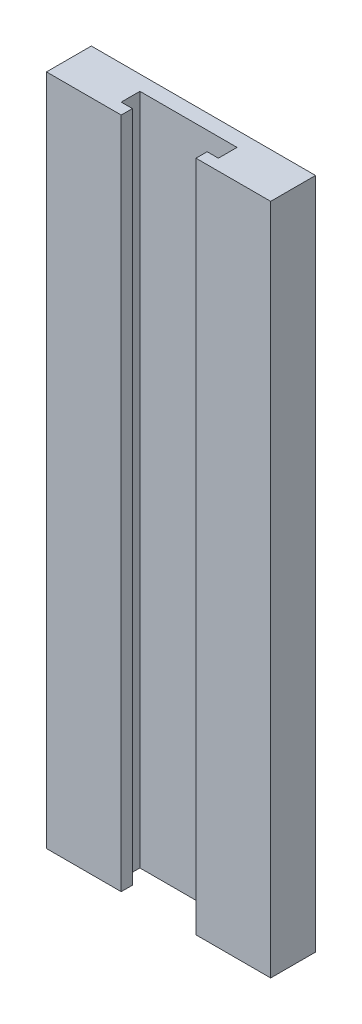
ISO-10303-21;
HEADER;
FILE_DESCRIPTION(('STEP AP214'),'2;1');
FILE_NAME('part.step','',(''),(''),'','','');
FILE_SCHEMA(('AUTOMOTIVE_DESIGN { 1 0 10303 214 1 1 1 1 }'));
ENDSEC;
DATA;
#1=APPLICATION_CONTEXT('core data for automotive mechanical design processes');
#2=APPLICATION_PROTOCOL_DEFINITION('international standard','automotive_design',2000,#1);
#3=PRODUCT_CONTEXT('',#1,'mechanical');
#4=PRODUCT('Part','Part','',(#3));
#5=PRODUCT_RELATED_PRODUCT_CATEGORY('part','',(#4));
#6=PRODUCT_DEFINITION_FORMATION('','',#4);
#7=PRODUCT_DEFINITION_CONTEXT('part definition',#1,'design');
#8=PRODUCT_DEFINITION('design','',#6,#7);
#9=PRODUCT_DEFINITION_SHAPE('','',#8);
#10=(LENGTH_UNIT() NAMED_UNIT(*) SI_UNIT(.MILLI.,.METRE.));
#11=(NAMED_UNIT(*) PLANE_ANGLE_UNIT() SI_UNIT($,.RADIAN.));
#12=(NAMED_UNIT(*) SI_UNIT($,.STERADIAN.) SOLID_ANGLE_UNIT());
#13=UNCERTAINTY_MEASURE_WITH_UNIT(LENGTH_MEASURE(1.E-05),#10,'distance_accuracy_value','');
#14=(GEOMETRIC_REPRESENTATION_CONTEXT(3) GLOBAL_UNCERTAINTY_ASSIGNED_CONTEXT((#13)) GLOBAL_UNIT_ASSIGNED_CONTEXT((#10,
#11,#12)) REPRESENTATION_CONTEXT('',''));
#15=CARTESIAN_POINT('',(0.,0.,0.));
#16=DIRECTION('',(0.,0.,1.));
#17=DIRECTION('',(1.,0.,0.));
#18=AXIS2_PLACEMENT_3D('',#15,#16,#17);
#19=CARTESIAN_POINT('',(6.50000000000001,25.,6.));
#20=DIRECTION('',(1.,0.,0.));
#21=DIRECTION('',(0.,1.,0.));
#22=AXIS2_PLACEMENT_3D('',#19,#20,#21);
#23=PLANE('',#22);
#24=DIRECTION('',(0.,-1.,0.));
#25=VECTOR('',#24,1.);
#26=CARTESIAN_POINT('',(6.50000000000001,25.,4.49999999999997));
#27=LINE('',#26,#25);
#28=CARTESIAN_POINT('',(6.50000000000001,25.,4.49999999999997));
#29=VERTEX_POINT('',#28);
#30=CARTESIAN_POINT('',(6.50000000000003,-65.,4.49999999999998));
#31=VERTEX_POINT('',#30);
#32=EDGE_CURVE('E175',#29,#31,#27,.T.);
#33=ORIENTED_EDGE('',*,*,#32,.F.);
#34=DIRECTION('',(0.,0.,-1.));
#35=VECTOR('',#34,1.);
#36=CARTESIAN_POINT('',(6.50000000000001,25.,6.));
#37=LINE('',#36,#35);
#38=CARTESIAN_POINT('',(6.50000000000002,25.,2.));
#39=VERTEX_POINT('',#38);
#40=EDGE_CURVE('E62',#29,#39,#37,.T.);
#41=ORIENTED_EDGE('',*,*,#40,.T.);
#42=DIRECTION('',(0.,-1.,0.));
#43=VECTOR('',#42,1.);
#44=CARTESIAN_POINT('',(6.50000000000001,25.,2.));
#45=LINE('',#44,#43);
#46=CARTESIAN_POINT('',(6.50000000000002,-65.,2.));
#47=VERTEX_POINT('',#46);
#48=EDGE_CURVE('E211',#39,#47,#45,.T.);
#49=ORIENTED_EDGE('',*,*,#48,.T.);
#50=DIRECTION('',(0.,0.,-1.));
#51=VECTOR('',#50,1.);
#52=CARTESIAN_POINT('',(6.50000000000002,-65.,6.));
#53=LINE('',#52,#51);
#54=EDGE_CURVE('E70',#31,#47,#53,.T.);
#55=ORIENTED_EDGE('',*,*,#54,.F.);
#56=EDGE_LOOP('',(#33,#41,#49,#55));
#57=FACE_BOUND('',#56,.T.);
#58=ADVANCED_FACE('F45',(#57),#23,.F.);
#59=CARTESIAN_POINT('',(-6.5,25.,6.));
#60=DIRECTION('',(-1.,0.,0.));
#61=DIRECTION('',(0.,-1.,0.));
#62=AXIS2_PLACEMENT_3D('',#59,#60,#61);
#63=PLANE('',#62);
#64=DIRECTION('',(0.,1.,0.));
#65=VECTOR('',#64,1.);
#66=CARTESIAN_POINT('',(-6.5,25.,4.5));
#67=LINE('',#66,#65);
#68=CARTESIAN_POINT('',(-6.49999999999999,-65.,4.49999999999998));
#69=VERTEX_POINT('',#68);
#70=CARTESIAN_POINT('',(-6.5,25.,4.5));
#71=VERTEX_POINT('',#70);
#72=EDGE_CURVE('E191',#69,#71,#67,.T.);
#73=ORIENTED_EDGE('',*,*,#72,.F.);
#74=DIRECTION('',(0.,0.,-1.));
#75=VECTOR('',#74,1.);
#76=CARTESIAN_POINT('',(-6.49999999999999,-65.,6.));
#77=LINE('',#76,#75);
#78=CARTESIAN_POINT('',(-6.5,-65.,2.));
#79=VERTEX_POINT('',#78);
#80=EDGE_CURVE('E225',#69,#79,#77,.T.);
#81=ORIENTED_EDGE('',*,*,#80,.T.);
#82=DIRECTION('',(0.,1.,0.));
#83=VECTOR('',#82,1.);
#84=CARTESIAN_POINT('',(-6.5,25.,2.));
#85=LINE('',#84,#83);
#86=CARTESIAN_POINT('',(-6.5,25.,2.));
#87=VERTEX_POINT('',#86);
#88=EDGE_CURVE('E213',#79,#87,#85,.T.);
#89=ORIENTED_EDGE('',*,*,#88,.T.);
#90=DIRECTION('',(0.,0.,-1.));
#91=VECTOR('',#90,1.);
#92=CARTESIAN_POINT('',(-6.5,25.,6.));
#93=LINE('',#92,#91);
#94=EDGE_CURVE('E221',#71,#87,#93,.T.);
#95=ORIENTED_EDGE('',*,*,#94,.F.);
#96=EDGE_LOOP('',(#73,#81,#89,#95));
#97=FACE_BOUND('',#96,.T.);
#98=ADVANCED_FACE('F252',(#97),#63,.F.);
#99=CARTESIAN_POINT('',(0.,0.,2.));
#100=DIRECTION('',(0.,0.,1.));
#101=DIRECTION('',(1.,0.,0.));
#102=AXIS2_PLACEMENT_3D('',#99,#100,#101);
#103=PLANE('',#102);
#104=DIRECTION('',(1.,0.,0.));
#105=VECTOR('',#104,1.);
#106=CARTESIAN_POINT('',(-7.99999999999999,-65.,2.));
#107=LINE('',#106,#105);
#108=EDGE_CURVE('E54',#79,#47,#107,.T.);
#109=ORIENTED_EDGE('',*,*,#108,.T.);
#110=ORIENTED_EDGE('',*,*,#48,.F.);
#111=DIRECTION('',(-1.,0.,0.));
#112=VECTOR('',#111,1.);
#113=CARTESIAN_POINT('',(-8.,25.,2.));
#114=LINE('',#113,#112);
#115=EDGE_CURVE('E11',#39,#87,#114,.T.);
#116=ORIENTED_EDGE('',*,*,#115,.T.);
#117=ORIENTED_EDGE('',*,*,#88,.F.);
#118=EDGE_LOOP('',(#109,#110,#116,#117));
#119=FACE_BOUND('',#118,.T.);
#120=ADVANCED_FACE('F245',(#119),#103,.T.);
#121=CARTESIAN_POINT('',(-7.99999999999999,-65.,2.));
#122=DIRECTION('',(0.,1.,0.));
#123=DIRECTION('',(0.,0.,1.));
#124=AXIS2_PLACEMENT_3D('',#121,#122,#123);
#125=PLANE('',#124);
#126=DIRECTION('',(1.,0.,0.));
#127=VECTOR('',#126,1.);
#128=CARTESIAN_POINT('',(-7.99999999999999,-65.,0.));
#129=LINE('',#128,#127);
#130=CARTESIAN_POINT('',(-15.,-65.,0.));
#131=VERTEX_POINT('',#130);
#132=CARTESIAN_POINT('',(15.,-65.,0.));
#133=VERTEX_POINT('',#132);
#134=EDGE_CURVE('E149',#131,#133,#129,.T.);
#135=ORIENTED_EDGE('',*,*,#134,.T.);
#136=DIRECTION('',(0.,0.,-1.));
#137=VECTOR('',#136,1.);
#138=CARTESIAN_POINT('',(15.,-65.,0.));
#139=LINE('',#138,#137);
#140=CARTESIAN_POINT('',(15.,-65.,6.));
#141=VERTEX_POINT('',#140);
#142=EDGE_CURVE('E172',#141,#133,#139,.T.);
#143=ORIENTED_EDGE('',*,*,#142,.F.);
#144=DIRECTION('',(1.,0.,0.));
#145=VECTOR('',#144,1.);
#146=CARTESIAN_POINT('',(8.00000000000001,-65.,6.));
#147=LINE('',#146,#145);
#148=CARTESIAN_POINT('',(5.00000000000002,-65.,6.));
#149=VERTEX_POINT('',#148);
#150=EDGE_CURVE('E210',#149,#141,#147,.T.);
#151=ORIENTED_EDGE('',*,*,#150,.F.);
#152=DIRECTION('',(0.,0.,1.));
#153=VECTOR('',#152,1.);
#154=CARTESIAN_POINT('',(5.00000000000002,-65.,6.));
#155=LINE('',#154,#153);
#156=CARTESIAN_POINT('',(5.00000000000002,-65.,4.49999999999998));
#157=VERTEX_POINT('',#156);
#158=EDGE_CURVE('E183',#157,#149,#155,.T.);
#159=ORIENTED_EDGE('',*,*,#158,.F.);
#160=DIRECTION('',(1.,0.,0.));
#161=VECTOR('',#160,1.);
#162=CARTESIAN_POINT('',(5.00000000000002,-65.,4.49999999999998));
#163=LINE('',#162,#161);
#164=EDGE_CURVE('E186',#157,#31,#163,.T.);
#165=ORIENTED_EDGE('',*,*,#164,.T.);
#166=ORIENTED_EDGE('',*,*,#54,.T.);
#167=ORIENTED_EDGE('',*,*,#108,.F.);
#168=ORIENTED_EDGE('',*,*,#80,.F.);
#169=DIRECTION('',(-1.,0.,0.));
#170=VECTOR('',#169,1.);
#171=CARTESIAN_POINT('',(-4.99999999999999,-65.,4.49999999999998));
#172=LINE('',#171,#170);
#173=CARTESIAN_POINT('',(-4.99999999999999,-65.,4.49999999999998));
#174=VERTEX_POINT('',#173);
#175=EDGE_CURVE('E206',#174,#69,#172,.T.);
#176=ORIENTED_EDGE('',*,*,#175,.F.);
#177=DIRECTION('',(0.,0.,-1.));
#178=VECTOR('',#177,1.);
#179=CARTESIAN_POINT('',(-4.99999999999999,-65.,6.));
#180=LINE('',#179,#178);
#181=CARTESIAN_POINT('',(-4.99999999999999,-65.,6.));
#182=VERTEX_POINT('',#181);
#183=EDGE_CURVE('E195',#182,#174,#180,.T.);
#184=ORIENTED_EDGE('',*,*,#183,.F.);
#185=DIRECTION('',(1.,0.,0.));
#186=VECTOR('',#185,1.);
#187=CARTESIAN_POINT('',(-8.00000000000001,-65.,6.));
#188=LINE('',#187,#186);
#189=CARTESIAN_POINT('',(-15.,-65.,6.));
#190=VERTEX_POINT('',#189);
#191=EDGE_CURVE('E217',#190,#182,#188,.T.);
#192=ORIENTED_EDGE('',*,*,#191,.F.);
#193=DIRECTION('',(0.,0.,1.));
#194=VECTOR('',#193,1.);
#195=CARTESIAN_POINT('',(-15.,-65.,0.));
#196=LINE('',#195,#194);
#197=EDGE_CURVE('E156',#131,#190,#196,.T.);
#198=ORIENTED_EDGE('',*,*,#197,.F.);
#199=EDGE_LOOP('',(#135,#143,#151,#159,#165,#166,#167,#168,#176,#184,#192,#198));
#200=FACE_BOUND('',#199,.T.);
#201=ADVANCED_FACE('F47',(#200),#125,.F.);
#202=CARTESIAN_POINT('',(-8.,25.,2.));
#203=DIRECTION('',(0.,-1.,0.));
#204=DIRECTION('',(0.,0.,-1.));
#205=AXIS2_PLACEMENT_3D('',#202,#203,#204);
#206=PLANE('',#205);
#207=DIRECTION('',(-1.,0.,0.));
#208=VECTOR('',#207,1.);
#209=CARTESIAN_POINT('',(-8.,25.,0.));
#210=LINE('',#209,#208);
#211=CARTESIAN_POINT('',(15.,25.,0.));
#212=VERTEX_POINT('',#211);
#213=CARTESIAN_POINT('',(-15.,25.,0.));
#214=VERTEX_POINT('',#213);
#215=EDGE_CURVE('E49',#212,#214,#210,.T.);
#216=ORIENTED_EDGE('',*,*,#215,.T.);
#217=DIRECTION('',(0.,0.,-1.));
#218=VECTOR('',#217,1.);
#219=CARTESIAN_POINT('',(-15.,25.,6.));
#220=LINE('',#219,#218);
#221=CARTESIAN_POINT('',(-15.,25.,6.));
#222=VERTEX_POINT('',#221);
#223=EDGE_CURVE('E143',#222,#214,#220,.T.);
#224=ORIENTED_EDGE('',*,*,#223,.F.);
#225=DIRECTION('',(-1.,0.,0.));
#226=VECTOR('',#225,1.);
#227=CARTESIAN_POINT('',(-8.,25.,6.));
#228=LINE('',#227,#226);
#229=CARTESIAN_POINT('',(-5.,25.,6.));
#230=VERTEX_POINT('',#229);
#231=EDGE_CURVE('E219',#230,#222,#228,.T.);
#232=ORIENTED_EDGE('',*,*,#231,.F.);
#233=DIRECTION('',(0.,0.,1.));
#234=VECTOR('',#233,1.);
#235=CARTESIAN_POINT('',(-5.,25.,6.));
#236=LINE('',#235,#234);
#237=CARTESIAN_POINT('',(-5.,25.,4.5));
#238=VERTEX_POINT('',#237);
#239=EDGE_CURVE('E199',#238,#230,#236,.T.);
#240=ORIENTED_EDGE('',*,*,#239,.F.);
#241=DIRECTION('',(-1.,0.,0.));
#242=VECTOR('',#241,1.);
#243=CARTESIAN_POINT('',(-5.,25.,4.5));
#244=LINE('',#243,#242);
#245=EDGE_CURVE('E202',#238,#71,#244,.T.);
#246=ORIENTED_EDGE('',*,*,#245,.T.);
#247=ORIENTED_EDGE('',*,*,#94,.T.);
#248=ORIENTED_EDGE('',*,*,#115,.F.);
#249=ORIENTED_EDGE('',*,*,#40,.F.);
#250=DIRECTION('',(1.,0.,0.));
#251=VECTOR('',#250,1.);
#252=CARTESIAN_POINT('',(5.00000000000001,25.,4.49999999999997));
#253=LINE('',#252,#251);
#254=CARTESIAN_POINT('',(5.00000000000001,25.,4.49999999999997));
#255=VERTEX_POINT('',#254);
#256=EDGE_CURVE('E189',#255,#29,#253,.T.);
#257=ORIENTED_EDGE('',*,*,#256,.F.);
#258=DIRECTION('',(0.,0.,-1.));
#259=VECTOR('',#258,1.);
#260=CARTESIAN_POINT('',(5.00000000000001,25.,6.));
#261=LINE('',#260,#259);
#262=CARTESIAN_POINT('',(5.00000000000001,25.,6.));
#263=VERTEX_POINT('',#262);
#264=EDGE_CURVE('E179',#263,#255,#261,.T.);
#265=ORIENTED_EDGE('',*,*,#264,.F.);
#266=DIRECTION('',(-1.,0.,0.));
#267=VECTOR('',#266,1.);
#268=CARTESIAN_POINT('',(8.00000000000001,25.,6.));
#269=LINE('',#268,#267);
#270=CARTESIAN_POINT('',(15.,25.,6.00000000000001));
#271=VERTEX_POINT('',#270);
#272=EDGE_CURVE('E214',#271,#263,#269,.T.);
#273=ORIENTED_EDGE('',*,*,#272,.F.);
#274=DIRECTION('',(0.,0.,1.));
#275=VECTOR('',#274,1.);
#276=CARTESIAN_POINT('',(15.,25.,0.));
#277=LINE('',#276,#275);
#278=EDGE_CURVE('E145',#212,#271,#277,.T.);
#279=ORIENTED_EDGE('',*,*,#278,.F.);
#280=EDGE_LOOP('',(#216,#224,#232,#240,#246,#247,#248,#249,#257,#265,#273,#279));
#281=FACE_BOUND('',#280,.T.);
#282=ADVANCED_FACE('F141',(#281),#206,.F.);
#283=CARTESIAN_POINT('',(0.,0.,0.));
#284=DIRECTION('',(0.,0.,1.));
#285=DIRECTION('',(1.,0.,0.));
#286=AXIS2_PLACEMENT_3D('',#283,#284,#285);
#287=PLANE('',#286);
#288=ORIENTED_EDGE('',*,*,#134,.F.);
#289=DIRECTION('',(0.,-1.,0.));
#290=VECTOR('',#289,1.);
#291=CARTESIAN_POINT('',(-15.,25.,0.));
#292=LINE('',#291,#290);
#293=EDGE_CURVE('E151',#214,#131,#292,.T.);
#294=ORIENTED_EDGE('',*,*,#293,.F.);
#295=ORIENTED_EDGE('',*,*,#215,.F.);
#296=DIRECTION('',(0.,1.,0.));
#297=VECTOR('',#296,1.);
#298=CARTESIAN_POINT('',(15.,25.,0.));
#299=LINE('',#298,#297);
#300=EDGE_CURVE('E166',#133,#212,#299,.T.);
#301=ORIENTED_EDGE('',*,*,#300,.F.);
#302=EDGE_LOOP('',(#288,#294,#295,#301));
#303=FACE_BOUND('',#302,.T.);
#304=ADVANCED_FACE('F152',(#303),#287,.F.);
#305=CARTESIAN_POINT('',(0.,0.,6.));
#306=DIRECTION('',(0.,0.,1.));
#307=DIRECTION('',(1.,0.,0.));
#308=AXIS2_PLACEMENT_3D('',#305,#306,#307);
#309=PLANE('',#308);
#310=ORIENTED_EDGE('',*,*,#231,.T.);
#311=DIRECTION('',(0.,1.,0.));
#312=VECTOR('',#311,1.);
#313=CARTESIAN_POINT('',(-15.,-65.,6.));
#314=LINE('',#313,#312);
#315=EDGE_CURVE('E161',#190,#222,#314,.T.);
#316=ORIENTED_EDGE('',*,*,#315,.F.);
#317=ORIENTED_EDGE('',*,*,#191,.T.);
#318=DIRECTION('',(0.,-1.,0.));
#319=VECTOR('',#318,1.);
#320=CARTESIAN_POINT('',(-5.,25.,6.));
#321=LINE('',#320,#319);
#322=EDGE_CURVE('E192',#230,#182,#321,.T.);
#323=ORIENTED_EDGE('',*,*,#322,.F.);
#324=EDGE_LOOP('',(#310,#316,#317,#323));
#325=FACE_BOUND('',#324,.T.);
#326=ADVANCED_FACE('F263',(#325),#309,.T.);
#327=CARTESIAN_POINT('',(0.,0.,6.));
#328=DIRECTION('',(0.,0.,-1.));
#329=DIRECTION('',(-1.,0.,0.));
#330=AXIS2_PLACEMENT_3D('',#327,#328,#329);
#331=PLANE('',#330);
#332=ORIENTED_EDGE('',*,*,#150,.T.);
#333=DIRECTION('',(0.,-1.,0.));
#334=VECTOR('',#333,1.);
#335=CARTESIAN_POINT('',(15.,25.,6.00000000000001));
#336=LINE('',#335,#334);
#337=EDGE_CURVE('E169',#271,#141,#336,.T.);
#338=ORIENTED_EDGE('',*,*,#337,.F.);
#339=ORIENTED_EDGE('',*,*,#272,.T.);
#340=DIRECTION('',(0.,1.,0.));
#341=VECTOR('',#340,1.);
#342=CARTESIAN_POINT('',(5.00000000000001,25.,6.));
#343=LINE('',#342,#341);
#344=EDGE_CURVE('E176',#149,#263,#343,.T.);
#345=ORIENTED_EDGE('',*,*,#344,.F.);
#346=EDGE_LOOP('',(#332,#338,#339,#345));
#347=FACE_BOUND('',#346,.T.);
#348=ADVANCED_FACE('F232',(#347),#331,.F.);
#349=CARTESIAN_POINT('',(-5.,25.,4.5));
#350=DIRECTION('',(0.,0.,1.));
#351=DIRECTION('',(0.,-1.,0.));
#352=AXIS2_PLACEMENT_3D('',#349,#350,#351);
#353=PLANE('',#352);
#354=ORIENTED_EDGE('',*,*,#72,.T.);
#355=ORIENTED_EDGE('',*,*,#245,.F.);
#356=DIRECTION('',(0.,1.,0.));
#357=VECTOR('',#356,1.);
#358=CARTESIAN_POINT('',(-5.,25.,4.5));
#359=LINE('',#358,#357);
#360=EDGE_CURVE('E197',#174,#238,#359,.T.);
#361=ORIENTED_EDGE('',*,*,#360,.F.);
#362=ORIENTED_EDGE('',*,*,#175,.T.);
#363=EDGE_LOOP('',(#354,#355,#361,#362));
#364=FACE_BOUND('',#363,.T.);
#365=ADVANCED_FACE('F258',(#364),#353,.F.);
#366=CARTESIAN_POINT('',(-5.,0.,0.));
#367=DIRECTION('',(1.,0.,0.));
#368=DIRECTION('',(0.,1.,0.));
#369=AXIS2_PLACEMENT_3D('',#366,#367,#368);
#370=PLANE('',#369);
#371=ORIENTED_EDGE('',*,*,#322,.T.);
#372=ORIENTED_EDGE('',*,*,#183,.T.);
#373=ORIENTED_EDGE('',*,*,#360,.T.);
#374=ORIENTED_EDGE('',*,*,#239,.T.);
#375=EDGE_LOOP('',(#371,#372,#373,#374));
#376=FACE_BOUND('',#375,.T.);
#377=ADVANCED_FACE('F260',(#376),#370,.T.);
#378=CARTESIAN_POINT('',(5.00000000000001,25.,4.49999999999997));
#379=DIRECTION('',(0.,0.,1.));
#380=DIRECTION('',(0.,-1.,0.));
#381=AXIS2_PLACEMENT_3D('',#378,#379,#380);
#382=PLANE('',#381);
#383=ORIENTED_EDGE('',*,*,#32,.T.);
#384=ORIENTED_EDGE('',*,*,#164,.F.);
#385=DIRECTION('',(0.,-1.,0.));
#386=VECTOR('',#385,1.);
#387=CARTESIAN_POINT('',(5.00000000000001,25.,4.49999999999997));
#388=LINE('',#387,#386);
#389=EDGE_CURVE('E181',#255,#157,#388,.T.);
#390=ORIENTED_EDGE('',*,*,#389,.F.);
#391=ORIENTED_EDGE('',*,*,#256,.T.);
#392=EDGE_LOOP('',(#383,#384,#390,#391));
#393=FACE_BOUND('',#392,.T.);
#394=ADVANCED_FACE('F242',(#393),#382,.F.);
#395=CARTESIAN_POINT('',(5.00000000000002,0.,0.));
#396=DIRECTION('',(1.,0.,0.));
#397=DIRECTION('',(0.,1.,0.));
#398=AXIS2_PLACEMENT_3D('',#395,#396,#397);
#399=PLANE('',#398);
#400=ORIENTED_EDGE('',*,*,#344,.T.);
#401=ORIENTED_EDGE('',*,*,#264,.T.);
#402=ORIENTED_EDGE('',*,*,#389,.T.);
#403=ORIENTED_EDGE('',*,*,#158,.T.);
#404=EDGE_LOOP('',(#400,#401,#402,#403));
#405=FACE_BOUND('',#404,.T.);
#406=ADVANCED_FACE('F237',(#405),#399,.F.);
#407=CARTESIAN_POINT('',(15.,0.,0.));
#408=DIRECTION('',(-1.,0.,0.));
#409=DIRECTION('',(0.,-1.,0.));
#410=AXIS2_PLACEMENT_3D('',#407,#408,#409);
#411=PLANE('',#410);
#412=ORIENTED_EDGE('',*,*,#300,.T.);
#413=ORIENTED_EDGE('',*,*,#278,.T.);
#414=ORIENTED_EDGE('',*,*,#337,.T.);
#415=ORIENTED_EDGE('',*,*,#142,.T.);
#416=EDGE_LOOP('',(#412,#413,#414,#415));
#417=FACE_BOUND('',#416,.T.);
#418=ADVANCED_FACE('F229',(#417),#411,.F.);
#419=CARTESIAN_POINT('',(-15.,0.,0.));
#420=DIRECTION('',(-1.,0.,0.));
#421=DIRECTION('',(0.,-1.,0.));
#422=AXIS2_PLACEMENT_3D('',#419,#420,#421);
#423=PLANE('',#422);
#424=ORIENTED_EDGE('',*,*,#223,.T.);
#425=ORIENTED_EDGE('',*,*,#293,.T.);
#426=ORIENTED_EDGE('',*,*,#197,.T.);
#427=ORIENTED_EDGE('',*,*,#315,.T.);
#428=EDGE_LOOP('',(#424,#425,#426,#427));
#429=FACE_BOUND('',#428,.T.);
#430=ADVANCED_FACE('F159',(#429),#423,.T.);
#431=CLOSED_SHELL('',(#58,#98,#120,#201,#282,#304,#326,#348,#365,#377,#394,#406,#418,#430));
#432=MANIFOLD_SOLID_BREP('B2',#431);
#433=ADVANCED_BREP_SHAPE_REPRESENTATION('',(#18,#432),#14);
#434=SHAPE_DEFINITION_REPRESENTATION(#9,#433);
ENDSEC;
END-ISO-10303-21;
